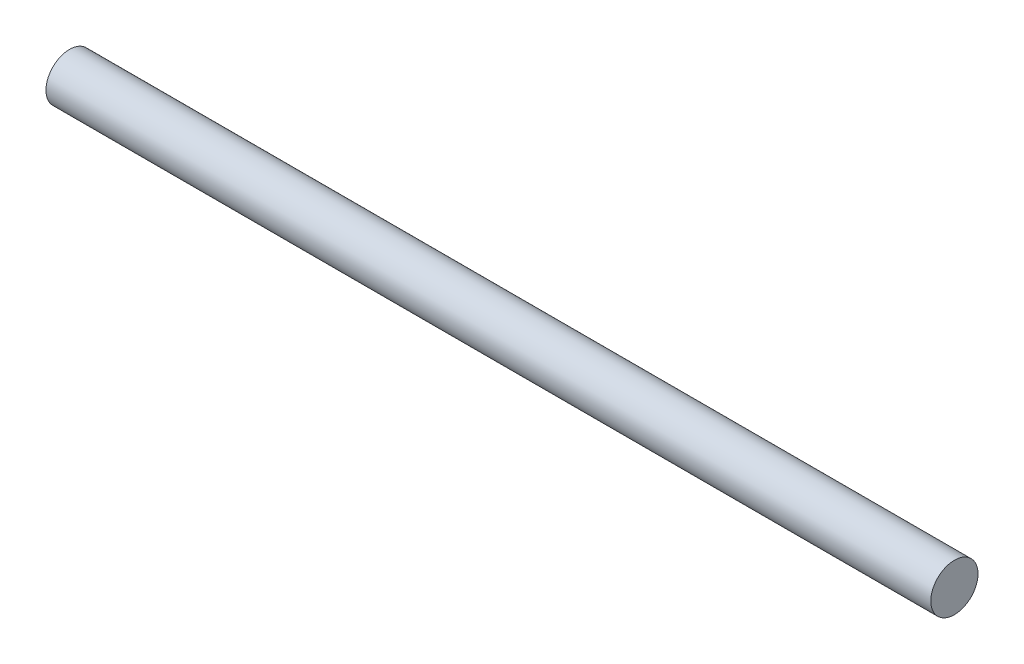
ISO-10303-21;
HEADER;
FILE_DESCRIPTION(('STEP AP214'),'2;1');
FILE_NAME('part.step','',(''),(''),'','','');
FILE_SCHEMA(('AUTOMOTIVE_DESIGN { 1 0 10303 214 1 1 1 1 }'));
ENDSEC;
DATA;
#1=APPLICATION_CONTEXT('core data for automotive mechanical design processes');
#2=APPLICATION_PROTOCOL_DEFINITION('international standard','automotive_design',2000,#1);
#3=PRODUCT_CONTEXT('',#1,'mechanical');
#4=PRODUCT('Part','Part','',(#3));
#5=PRODUCT_RELATED_PRODUCT_CATEGORY('part','',(#4));
#6=PRODUCT_DEFINITION_FORMATION('','',#4);
#7=PRODUCT_DEFINITION_CONTEXT('part definition',#1,'design');
#8=PRODUCT_DEFINITION('design','',#6,#7);
#9=PRODUCT_DEFINITION_SHAPE('','',#8);
#10=(LENGTH_UNIT() NAMED_UNIT(*) SI_UNIT(.MILLI.,.METRE.));
#11=(NAMED_UNIT(*) PLANE_ANGLE_UNIT() SI_UNIT($,.RADIAN.));
#12=(NAMED_UNIT(*) SI_UNIT($,.STERADIAN.) SOLID_ANGLE_UNIT());
#13=UNCERTAINTY_MEASURE_WITH_UNIT(LENGTH_MEASURE(1.E-05),#10,'distance_accuracy_value','');
#14=(GEOMETRIC_REPRESENTATION_CONTEXT(3) GLOBAL_UNCERTAINTY_ASSIGNED_CONTEXT((#13)) GLOBAL_UNIT_ASSIGNED_CONTEXT((#10,
#11,#12)) REPRESENTATION_CONTEXT('',''));
#15=CARTESIAN_POINT('',(0.,0.,0.));
#16=DIRECTION('',(0.,0.,1.));
#17=DIRECTION('',(1.,0.,0.));
#18=AXIS2_PLACEMENT_3D('',#15,#16,#17);
#19=CARTESIAN_POINT('',(150.,0.,0.));
#20=DIRECTION('',(-1.,0.,0.));
#21=DIRECTION('',(0.,0.,1.));
#22=AXIS2_PLACEMENT_3D('',#19,#20,#21);
#23=CYLINDRICAL_SURFACE('',#22,4.);
#24=CARTESIAN_POINT('',(150.,0.,0.));
#25=DIRECTION('',(1.,0.,0.));
#26=DIRECTION('',(0.,0.,-1.));
#27=AXIS2_PLACEMENT_3D('',#24,#25,#26);
#28=CIRCLE('',#27,4.);
#29=CARTESIAN_POINT('',(150.,0.,-4.));
#30=VERTEX_POINT('',#29);
#31=EDGE_CURVE('E10',#30,#30,#28,.T.);
#32=ORIENTED_EDGE('',*,*,#31,.F.);
#33=EDGE_LOOP('',(#32));
#34=FACE_BOUND('',#33,.T.);
#35=CARTESIAN_POINT('',(0.,0.,0.));
#36=DIRECTION('',(1.,0.,0.));
#37=DIRECTION('',(0.,0.,-1.));
#38=AXIS2_PLACEMENT_3D('',#35,#36,#37);
#39=CIRCLE('',#38,4.);
#40=CARTESIAN_POINT('',(0.,0.,-4.));
#41=VERTEX_POINT('',#40);
#42=EDGE_CURVE('E35',#41,#41,#39,.T.);
#43=ORIENTED_EDGE('',*,*,#42,.T.);
#44=EDGE_LOOP('',(#43));
#45=FACE_BOUND('',#44,.T.);
#46=ADVANCED_FACE('F32',(#34,#45),#23,.T.);
#47=CARTESIAN_POINT('',(150.,0.,0.));
#48=DIRECTION('',(1.,0.,0.));
#49=DIRECTION('',(0.,0.,-1.));
#50=AXIS2_PLACEMENT_3D('',#47,#48,#49);
#51=PLANE('',#50);
#52=ORIENTED_EDGE('',*,*,#31,.T.);
#53=EDGE_LOOP('',(#52));
#54=FACE_BOUND('',#53,.T.);
#55=ADVANCED_FACE('F47',(#54),#51,.T.);
#56=CARTESIAN_POINT('',(0.,0.,0.));
#57=DIRECTION('',(1.,0.,0.));
#58=DIRECTION('',(0.,0.,-1.));
#59=AXIS2_PLACEMENT_3D('',#56,#57,#58);
#60=PLANE('',#59);
#61=ORIENTED_EDGE('',*,*,#42,.F.);
#62=EDGE_LOOP('',(#61));
#63=FACE_BOUND('',#62,.T.);
#64=ADVANCED_FACE('F45',(#63),#60,.F.);
#65=CLOSED_SHELL('',(#46,#55,#64));
#66=MANIFOLD_SOLID_BREP('B2',#65);
#67=ADVANCED_BREP_SHAPE_REPRESENTATION('',(#18,#66),#14);
#68=SHAPE_DEFINITION_REPRESENTATION(#9,#67);
ENDSEC;
END-ISO-10303-21;
